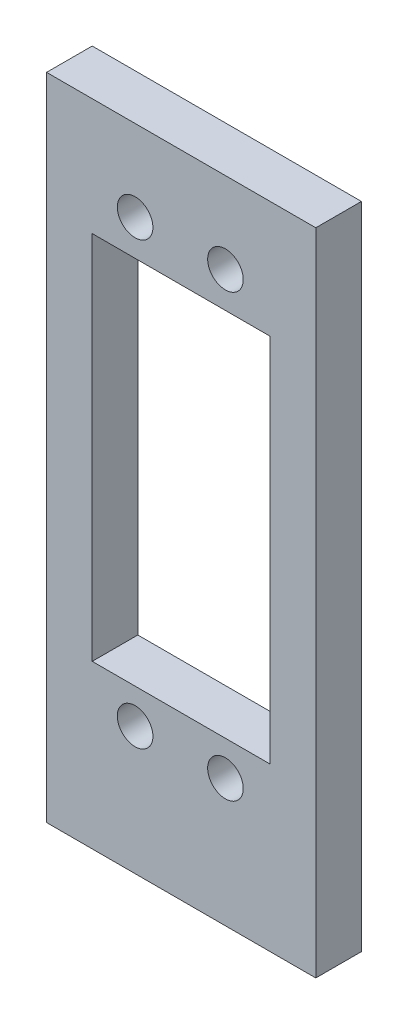
ISO-10303-21;
HEADER;
FILE_DESCRIPTION(('STEP AP214'),'2;1');
FILE_NAME('part.step','',(''),(''),'','','');
FILE_SCHEMA(('AUTOMOTIVE_DESIGN { 1 0 10303 214 1 1 1 1 }'));
ENDSEC;
DATA;
#1=APPLICATION_CONTEXT('core data for automotive mechanical design processes');
#2=APPLICATION_PROTOCOL_DEFINITION('international standard','automotive_design',2000,#1);
#3=PRODUCT_CONTEXT('',#1,'mechanical');
#4=PRODUCT('Part','Part','',(#3));
#5=PRODUCT_RELATED_PRODUCT_CATEGORY('part','',(#4));
#6=PRODUCT_DEFINITION_FORMATION('','',#4);
#7=PRODUCT_DEFINITION_CONTEXT('part definition',#1,'design');
#8=PRODUCT_DEFINITION('design','',#6,#7);
#9=PRODUCT_DEFINITION_SHAPE('','',#8);
#10=(LENGTH_UNIT() NAMED_UNIT(*) SI_UNIT(.MILLI.,.METRE.));
#11=(NAMED_UNIT(*) PLANE_ANGLE_UNIT() SI_UNIT($,.RADIAN.));
#12=(NAMED_UNIT(*) SI_UNIT($,.STERADIAN.) SOLID_ANGLE_UNIT());
#13=UNCERTAINTY_MEASURE_WITH_UNIT(LENGTH_MEASURE(1.E-05),#10,'distance_accuracy_value','');
#14=(GEOMETRIC_REPRESENTATION_CONTEXT(3) GLOBAL_UNCERTAINTY_ASSIGNED_CONTEXT((#13)) GLOBAL_UNIT_ASSIGNED_CONTEXT((#10,
#11,#12)) REPRESENTATION_CONTEXT('',''));
#15=CARTESIAN_POINT('',(0.,0.,0.));
#16=DIRECTION('',(0.,0.,1.));
#17=DIRECTION('',(1.,0.,0.));
#18=AXIS2_PLACEMENT_3D('',#15,#16,#17);
#19=CARTESIAN_POINT('',(14.75,33.1,5.));
#20=DIRECTION('',(0.,0.,-1.));
#21=DIRECTION('',(-1.,0.,0.));
#22=AXIS2_PLACEMENT_3D('',#19,#20,#21);
#23=PLANE('',#22);
#24=CARTESIAN_POINT('',(4.85,-24.1,5.));
#25=DIRECTION('',(0.,0.,1.));
#26=DIRECTION('',(1.,0.,0.));
#27=AXIS2_PLACEMENT_3D('',#24,#25,#26);
#28=CIRCLE('',#27,1.95);
#29=CARTESIAN_POINT('',(6.8,-24.1,5.));
#30=VERTEX_POINT('',#29);
#31=EDGE_CURVE('E180',#30,#30,#28,.T.);
#32=ORIENTED_EDGE('',*,*,#31,.F.);
#33=EDGE_LOOP('',(#32));
#34=FACE_BOUND('',#33,.T.);
#35=CARTESIAN_POINT('',(-5.05,-24.1,5.));
#36=DIRECTION('',(0.,0.,1.));
#37=DIRECTION('',(1.,0.,0.));
#38=AXIS2_PLACEMENT_3D('',#35,#36,#37);
#39=CIRCLE('',#38,1.95);
#40=CARTESIAN_POINT('',(-3.1,-24.1,5.));
#41=VERTEX_POINT('',#40);
#42=EDGE_CURVE('E170',#41,#41,#39,.T.);
#43=ORIENTED_EDGE('',*,*,#42,.F.);
#44=EDGE_LOOP('',(#43));
#45=FACE_BOUND('',#44,.T.);
#46=CARTESIAN_POINT('',(4.85,24.2,5.));
#47=DIRECTION('',(0.,0.,1.));
#48=DIRECTION('',(1.,0.,0.));
#49=AXIS2_PLACEMENT_3D('',#46,#47,#48);
#50=CIRCLE('',#49,1.95);
#51=CARTESIAN_POINT('',(6.8,24.2,5.));
#52=VERTEX_POINT('',#51);
#53=EDGE_CURVE('E167',#52,#52,#50,.T.);
#54=ORIENTED_EDGE('',*,*,#53,.F.);
#55=EDGE_LOOP('',(#54));
#56=FACE_BOUND('',#55,.T.);
#57=CARTESIAN_POINT('',(-5.05,24.2,5.));
#58=DIRECTION('',(0.,0.,1.));
#59=DIRECTION('',(1.,0.,0.));
#60=AXIS2_PLACEMENT_3D('',#57,#58,#59);
#61=CIRCLE('',#60,1.95);
#62=CARTESIAN_POINT('',(-3.1,24.2,5.));
#63=VERTEX_POINT('',#62);
#64=EDGE_CURVE('E164',#63,#63,#61,.T.);
#65=ORIENTED_EDGE('',*,*,#64,.F.);
#66=EDGE_LOOP('',(#65));
#67=FACE_BOUND('',#66,.T.);
#68=DIRECTION('',(0.,1.,0.));
#69=VECTOR('',#68,1.);
#70=CARTESIAN_POINT('',(14.75,-38.1,5.));
#71=LINE('',#70,#69);
#72=CARTESIAN_POINT('',(14.75,-38.1,5.));
#73=VERTEX_POINT('',#72);
#74=CARTESIAN_POINT('',(14.75,33.1,5.));
#75=VERTEX_POINT('',#74);
#76=EDGE_CURVE('E137',#73,#75,#71,.T.);
#77=ORIENTED_EDGE('',*,*,#76,.T.);
#78=DIRECTION('',(-1.,0.,0.));
#79=VECTOR('',#78,1.);
#80=CARTESIAN_POINT('',(-14.75,33.1,5.));
#81=LINE('',#80,#79);
#82=CARTESIAN_POINT('',(-14.75,33.1,5.));
#83=VERTEX_POINT('',#82);
#84=EDGE_CURVE('E139',#75,#83,#81,.T.);
#85=ORIENTED_EDGE('',*,*,#84,.T.);
#86=DIRECTION('',(0.,-1.,0.));
#87=VECTOR('',#86,1.);
#88=CARTESIAN_POINT('',(-14.75,33.1,5.));
#89=LINE('',#88,#87);
#90=CARTESIAN_POINT('',(-14.75,-38.1,5.));
#91=VERTEX_POINT('',#90);
#92=EDGE_CURVE('E142',#83,#91,#89,.T.);
#93=ORIENTED_EDGE('',*,*,#92,.T.);
#94=DIRECTION('',(1.,0.,0.));
#95=VECTOR('',#94,1.);
#96=CARTESIAN_POINT('',(-14.75,-38.1,5.));
#97=LINE('',#96,#95);
#98=EDGE_CURVE('E144',#91,#73,#97,.T.);
#99=ORIENTED_EDGE('',*,*,#98,.T.);
#100=EDGE_LOOP('',(#77,#85,#93,#99));
#101=FACE_BOUND('',#100,.T.);
#102=DIRECTION('',(-1.,0.,0.));
#103=VECTOR('',#102,1.);
#104=CARTESIAN_POINT('',(9.75,20.3,5.));
#105=LINE('',#104,#103);
#106=CARTESIAN_POINT('',(9.75,20.3,5.));
#107=VERTEX_POINT('',#106);
#108=CARTESIAN_POINT('',(-9.75,20.3,5.));
#109=VERTEX_POINT('',#108);
#110=EDGE_CURVE('E99',#107,#109,#105,.T.);
#111=ORIENTED_EDGE('',*,*,#110,.F.);
#112=DIRECTION('',(0.,1.,0.));
#113=VECTOR('',#112,1.);
#114=CARTESIAN_POINT('',(9.75,-20.3,5.));
#115=LINE('',#114,#113);
#116=CARTESIAN_POINT('',(9.75,-20.3,5.));
#117=VERTEX_POINT('',#116);
#118=EDGE_CURVE('E121',#117,#107,#115,.T.);
#119=ORIENTED_EDGE('',*,*,#118,.F.);
#120=DIRECTION('',(1.,0.,0.));
#121=VECTOR('',#120,1.);
#122=CARTESIAN_POINT('',(9.75,-20.3,5.));
#123=LINE('',#122,#121);
#124=CARTESIAN_POINT('',(-9.75,-20.3,5.));
#125=VERTEX_POINT('',#124);
#126=EDGE_CURVE('E119',#125,#117,#123,.T.);
#127=ORIENTED_EDGE('',*,*,#126,.F.);
#128=DIRECTION('',(0.,-1.,0.));
#129=VECTOR('',#128,1.);
#130=CARTESIAN_POINT('',(-9.75,-20.3,5.));
#131=LINE('',#130,#129);
#132=EDGE_CURVE('E107',#109,#125,#131,.T.);
#133=ORIENTED_EDGE('',*,*,#132,.F.);
#134=EDGE_LOOP('',(#111,#119,#127,#133));
#135=FACE_BOUND('',#134,.T.);
#136=ADVANCED_FACE('F32',(#34,#45,#56,#67,#101,#135),#23,.F.);
#137=CARTESIAN_POINT('',(14.75,33.1,0.));
#138=DIRECTION('',(0.,0.,-1.));
#139=DIRECTION('',(-1.,0.,0.));
#140=AXIS2_PLACEMENT_3D('',#137,#138,#139);
#141=PLANE('',#140);
#142=CARTESIAN_POINT('',(4.85,-24.1,0.));
#143=DIRECTION('',(0.,0.,-1.));
#144=DIRECTION('',(-1.,0.,0.));
#145=AXIS2_PLACEMENT_3D('',#142,#143,#144);
#146=CIRCLE('',#145,1.95);
#147=CARTESIAN_POINT('',(2.9,-24.1,0.));
#148=VERTEX_POINT('',#147);
#149=EDGE_CURVE('E36',#148,#148,#146,.T.);
#150=ORIENTED_EDGE('',*,*,#149,.F.);
#151=EDGE_LOOP('',(#150));
#152=FACE_BOUND('',#151,.T.);
#153=CARTESIAN_POINT('',(-5.05,-24.1,0.));
#154=DIRECTION('',(0.,0.,-1.));
#155=DIRECTION('',(-1.,0.,0.));
#156=AXIS2_PLACEMENT_3D('',#153,#154,#155);
#157=CIRCLE('',#156,1.95);
#158=CARTESIAN_POINT('',(-7.,-24.1,0.));
#159=VERTEX_POINT('',#158);
#160=EDGE_CURVE('E168',#159,#159,#157,.T.);
#161=ORIENTED_EDGE('',*,*,#160,.F.);
#162=EDGE_LOOP('',(#161));
#163=FACE_BOUND('',#162,.T.);
#164=CARTESIAN_POINT('',(4.85,24.2,0.));
#165=DIRECTION('',(0.,0.,-1.));
#166=DIRECTION('',(-1.,0.,0.));
#167=AXIS2_PLACEMENT_3D('',#164,#165,#166);
#168=CIRCLE('',#167,1.95);
#169=CARTESIAN_POINT('',(2.9,24.2,0.));
#170=VERTEX_POINT('',#169);
#171=EDGE_CURVE('E165',#170,#170,#168,.T.);
#172=ORIENTED_EDGE('',*,*,#171,.F.);
#173=EDGE_LOOP('',(#172));
#174=FACE_BOUND('',#173,.T.);
#175=CARTESIAN_POINT('',(-5.05,24.2,0.));
#176=DIRECTION('',(0.,0.,-1.));
#177=DIRECTION('',(-1.,0.,0.));
#178=AXIS2_PLACEMENT_3D('',#175,#176,#177);
#179=CIRCLE('',#178,1.95);
#180=CARTESIAN_POINT('',(-7.,24.2,0.));
#181=VERTEX_POINT('',#180);
#182=EDGE_CURVE('E127',#181,#181,#179,.T.);
#183=ORIENTED_EDGE('',*,*,#182,.F.);
#184=EDGE_LOOP('',(#183));
#185=FACE_BOUND('',#184,.T.);
#186=DIRECTION('',(0.,1.,0.));
#187=VECTOR('',#186,1.);
#188=CARTESIAN_POINT('',(14.75,33.1,0.));
#189=LINE('',#188,#187);
#190=CARTESIAN_POINT('',(14.75,-38.1,0.));
#191=VERTEX_POINT('',#190);
#192=CARTESIAN_POINT('',(14.75,33.1,0.));
#193=VERTEX_POINT('',#192);
#194=EDGE_CURVE('E115',#191,#193,#189,.T.);
#195=ORIENTED_EDGE('',*,*,#194,.F.);
#196=DIRECTION('',(1.,0.,0.));
#197=VECTOR('',#196,1.);
#198=CARTESIAN_POINT('',(-14.75,-38.1,0.));
#199=LINE('',#198,#197);
#200=CARTESIAN_POINT('',(-14.75,-38.1,0.));
#201=VERTEX_POINT('',#200);
#202=EDGE_CURVE('E140',#201,#191,#199,.T.);
#203=ORIENTED_EDGE('',*,*,#202,.F.);
#204=DIRECTION('',(0.,-1.,0.));
#205=VECTOR('',#204,1.);
#206=CARTESIAN_POINT('',(-14.75,0.,0.));
#207=LINE('',#206,#205);
#208=CARTESIAN_POINT('',(-14.75,33.1,0.));
#209=VERTEX_POINT('',#208);
#210=EDGE_CURVE('E151',#209,#201,#207,.T.);
#211=ORIENTED_EDGE('',*,*,#210,.F.);
#212=DIRECTION('',(-1.,0.,0.));
#213=VECTOR('',#212,1.);
#214=CARTESIAN_POINT('',(-14.75,33.1,0.));
#215=LINE('',#214,#213);
#216=EDGE_CURVE('E148',#193,#209,#215,.T.);
#217=ORIENTED_EDGE('',*,*,#216,.F.);
#218=EDGE_LOOP('',(#195,#203,#211,#217));
#219=FACE_BOUND('',#218,.T.);
#220=DIRECTION('',(0.,1.,0.));
#221=VECTOR('',#220,1.);
#222=CARTESIAN_POINT('',(9.75,-20.3,0.));
#223=LINE('',#222,#221);
#224=CARTESIAN_POINT('',(9.75,-20.3,0.));
#225=VERTEX_POINT('',#224);
#226=CARTESIAN_POINT('',(9.75,20.3,0.));
#227=VERTEX_POINT('',#226);
#228=EDGE_CURVE('E108',#225,#227,#223,.T.);
#229=ORIENTED_EDGE('',*,*,#228,.T.);
#230=DIRECTION('',(-1.,0.,0.));
#231=VECTOR('',#230,1.);
#232=CARTESIAN_POINT('',(9.75,20.3,0.));
#233=LINE('',#232,#231);
#234=CARTESIAN_POINT('',(-9.75,20.3,0.));
#235=VERTEX_POINT('',#234);
#236=EDGE_CURVE('E57',#227,#235,#233,.T.);
#237=ORIENTED_EDGE('',*,*,#236,.T.);
#238=DIRECTION('',(0.,-1.,0.));
#239=VECTOR('',#238,1.);
#240=CARTESIAN_POINT('',(-9.75,-20.3,0.));
#241=LINE('',#240,#239);
#242=CARTESIAN_POINT('',(-9.75,-20.3,0.));
#243=VERTEX_POINT('',#242);
#244=EDGE_CURVE('E114',#235,#243,#241,.T.);
#245=ORIENTED_EDGE('',*,*,#244,.T.);
#246=DIRECTION('',(1.,0.,0.));
#247=VECTOR('',#246,1.);
#248=CARTESIAN_POINT('',(9.75,-20.3,0.));
#249=LINE('',#248,#247);
#250=EDGE_CURVE('E129',#243,#225,#249,.T.);
#251=ORIENTED_EDGE('',*,*,#250,.T.);
#252=EDGE_LOOP('',(#229,#237,#245,#251));
#253=FACE_BOUND('',#252,.T.);
#254=ADVANCED_FACE('F189',(#152,#163,#174,#185,#219,#253),#141,.T.);
#255=CARTESIAN_POINT('',(14.75,33.1,5.));
#256=DIRECTION('',(-1.,0.,0.));
#257=DIRECTION('',(0.,0.,1.));
#258=AXIS2_PLACEMENT_3D('',#255,#256,#257);
#259=PLANE('',#258);
#260=ORIENTED_EDGE('',*,*,#194,.T.);
#261=DIRECTION('',(0.,0.,-1.));
#262=VECTOR('',#261,1.);
#263=CARTESIAN_POINT('',(14.75,33.1,5.));
#264=LINE('',#263,#262);
#265=EDGE_CURVE('E11',#75,#193,#264,.T.);
#266=ORIENTED_EDGE('',*,*,#265,.F.);
#267=ORIENTED_EDGE('',*,*,#76,.F.);
#268=DIRECTION('',(0.,0.,-1.));
#269=VECTOR('',#268,1.);
#270=CARTESIAN_POINT('',(14.75,-38.1,5.));
#271=LINE('',#270,#269);
#272=EDGE_CURVE('E146',#73,#191,#271,.T.);
#273=ORIENTED_EDGE('',*,*,#272,.T.);
#274=EDGE_LOOP('',(#260,#266,#267,#273));
#275=FACE_BOUND('',#274,.T.);
#276=ADVANCED_FACE('F34',(#275),#259,.F.);
#277=CARTESIAN_POINT('',(-14.75,33.1,5.));
#278=DIRECTION('',(0.,-1.,0.));
#279=DIRECTION('',(0.,0.,-1.));
#280=AXIS2_PLACEMENT_3D('',#277,#278,#279);
#281=PLANE('',#280);
#282=ORIENTED_EDGE('',*,*,#216,.T.);
#283=DIRECTION('',(0.,0.,-1.));
#284=VECTOR('',#283,1.);
#285=CARTESIAN_POINT('',(-14.75,33.1,5.));
#286=LINE('',#285,#284);
#287=EDGE_CURVE('E41',#83,#209,#286,.T.);
#288=ORIENTED_EDGE('',*,*,#287,.F.);
#289=ORIENTED_EDGE('',*,*,#84,.F.);
#290=ORIENTED_EDGE('',*,*,#265,.T.);
#291=EDGE_LOOP('',(#282,#288,#289,#290));
#292=FACE_BOUND('',#291,.T.);
#293=ADVANCED_FACE('F201',(#292),#281,.F.);
#294=CARTESIAN_POINT('',(-14.75,0.,5.));
#295=DIRECTION('',(1.,0.,0.));
#296=DIRECTION('',(0.,1.,0.));
#297=AXIS2_PLACEMENT_3D('',#294,#295,#296);
#298=PLANE('',#297);
#299=ORIENTED_EDGE('',*,*,#210,.T.);
#300=DIRECTION('',(0.,0.,-1.));
#301=VECTOR('',#300,1.);
#302=CARTESIAN_POINT('',(-14.75,-38.1,5.));
#303=LINE('',#302,#301);
#304=EDGE_CURVE('E157',#91,#201,#303,.T.);
#305=ORIENTED_EDGE('',*,*,#304,.F.);
#306=ORIENTED_EDGE('',*,*,#92,.F.);
#307=ORIENTED_EDGE('',*,*,#287,.T.);
#308=EDGE_LOOP('',(#299,#305,#306,#307));
#309=FACE_BOUND('',#308,.T.);
#310=ADVANCED_FACE('F205',(#309),#298,.F.);
#311=CARTESIAN_POINT('',(-14.75,-38.1,5.));
#312=DIRECTION('',(0.,1.,0.));
#313=DIRECTION('',(0.,0.,1.));
#314=AXIS2_PLACEMENT_3D('',#311,#312,#313);
#315=PLANE('',#314);
#316=ORIENTED_EDGE('',*,*,#202,.T.);
#317=ORIENTED_EDGE('',*,*,#272,.F.);
#318=ORIENTED_EDGE('',*,*,#98,.F.);
#319=ORIENTED_EDGE('',*,*,#304,.T.);
#320=EDGE_LOOP('',(#316,#317,#318,#319));
#321=FACE_BOUND('',#320,.T.);
#322=ADVANCED_FACE('F208',(#321),#315,.F.);
#323=CARTESIAN_POINT('',(9.75,20.3,5.));
#324=DIRECTION('',(0.,-1.,0.));
#325=DIRECTION('',(0.,0.,-1.));
#326=AXIS2_PLACEMENT_3D('',#323,#324,#325);
#327=PLANE('',#326);
#328=ORIENTED_EDGE('',*,*,#236,.F.);
#329=DIRECTION('',(0.,0.,-1.));
#330=VECTOR('',#329,1.);
#331=CARTESIAN_POINT('',(9.75,20.3,5.));
#332=LINE('',#331,#330);
#333=EDGE_CURVE('E103',#107,#227,#332,.T.);
#334=ORIENTED_EDGE('',*,*,#333,.F.);
#335=ORIENTED_EDGE('',*,*,#110,.T.);
#336=DIRECTION('',(0.,0.,-1.));
#337=VECTOR('',#336,1.);
#338=CARTESIAN_POINT('',(-9.75,20.3,5.));
#339=LINE('',#338,#337);
#340=EDGE_CURVE('E102',#109,#235,#339,.T.);
#341=ORIENTED_EDGE('',*,*,#340,.T.);
#342=EDGE_LOOP('',(#328,#334,#335,#341));
#343=FACE_BOUND('',#342,.T.);
#344=ADVANCED_FACE('F101',(#343),#327,.T.);
#345=CARTESIAN_POINT('',(-9.75,-20.3,5.));
#346=DIRECTION('',(1.,0.,0.));
#347=DIRECTION('',(0.,0.,-1.));
#348=AXIS2_PLACEMENT_3D('',#345,#346,#347);
#349=PLANE('',#348);
#350=ORIENTED_EDGE('',*,*,#244,.F.);
#351=ORIENTED_EDGE('',*,*,#340,.F.);
#352=ORIENTED_EDGE('',*,*,#132,.T.);
#353=DIRECTION('',(0.,0.,-1.));
#354=VECTOR('',#353,1.);
#355=CARTESIAN_POINT('',(-9.75,-20.3,5.));
#356=LINE('',#355,#354);
#357=EDGE_CURVE('E116',#125,#243,#356,.T.);
#358=ORIENTED_EDGE('',*,*,#357,.T.);
#359=EDGE_LOOP('',(#350,#351,#352,#358));
#360=FACE_BOUND('',#359,.T.);
#361=ADVANCED_FACE('F111',(#360),#349,.T.);
#362=CARTESIAN_POINT('',(9.75,-20.3,5.));
#363=DIRECTION('',(0.,1.,0.));
#364=DIRECTION('',(0.,0.,1.));
#365=AXIS2_PLACEMENT_3D('',#362,#363,#364);
#366=PLANE('',#365);
#367=ORIENTED_EDGE('',*,*,#250,.F.);
#368=ORIENTED_EDGE('',*,*,#357,.F.);
#369=ORIENTED_EDGE('',*,*,#126,.T.);
#370=DIRECTION('',(0.,0.,-1.));
#371=VECTOR('',#370,1.);
#372=CARTESIAN_POINT('',(9.75,-20.3,5.));
#373=LINE('',#372,#371);
#374=EDGE_CURVE('E49',#117,#225,#373,.T.);
#375=ORIENTED_EDGE('',*,*,#374,.T.);
#376=EDGE_LOOP('',(#367,#368,#369,#375));
#377=FACE_BOUND('',#376,.T.);
#378=ADVANCED_FACE('F217',(#377),#366,.T.);
#379=CARTESIAN_POINT('',(9.75,-20.3,5.));
#380=DIRECTION('',(-1.,0.,0.));
#381=DIRECTION('',(0.,0.,1.));
#382=AXIS2_PLACEMENT_3D('',#379,#380,#381);
#383=PLANE('',#382);
#384=ORIENTED_EDGE('',*,*,#228,.F.);
#385=ORIENTED_EDGE('',*,*,#374,.F.);
#386=ORIENTED_EDGE('',*,*,#118,.T.);
#387=ORIENTED_EDGE('',*,*,#333,.T.);
#388=EDGE_LOOP('',(#384,#385,#386,#387));
#389=FACE_BOUND('',#388,.T.);
#390=ADVANCED_FACE('F215',(#389),#383,.T.);
#391=CARTESIAN_POINT('',(-5.05,24.2,-5.));
#392=DIRECTION('',(0.,0.,1.));
#393=DIRECTION('',(1.,0.,0.));
#394=AXIS2_PLACEMENT_3D('',#391,#392,#393);
#395=CYLINDRICAL_SURFACE('',#394,1.95);
#396=ORIENTED_EDGE('',*,*,#182,.T.);
#397=EDGE_LOOP('',(#396));
#398=FACE_BOUND('',#397,.T.);
#399=ORIENTED_EDGE('',*,*,#64,.T.);
#400=EDGE_LOOP('',(#399));
#401=FACE_BOUND('',#400,.T.);
#402=ADVANCED_FACE('F185',(#398,#401),#395,.F.);
#403=CARTESIAN_POINT('',(4.85,24.2,-5.));
#404=DIRECTION('',(0.,0.,1.));
#405=DIRECTION('',(1.,0.,0.));
#406=AXIS2_PLACEMENT_3D('',#403,#404,#405);
#407=CYLINDRICAL_SURFACE('',#406,1.95);
#408=ORIENTED_EDGE('',*,*,#171,.T.);
#409=EDGE_LOOP('',(#408));
#410=FACE_BOUND('',#409,.T.);
#411=ORIENTED_EDGE('',*,*,#53,.T.);
#412=EDGE_LOOP('',(#411));
#413=FACE_BOUND('',#412,.T.);
#414=ADVANCED_FACE('F223',(#410,#413),#407,.F.);
#415=CARTESIAN_POINT('',(-5.05,-24.1,-5.));
#416=DIRECTION('',(0.,0.,1.));
#417=DIRECTION('',(1.,0.,0.));
#418=AXIS2_PLACEMENT_3D('',#415,#416,#417);
#419=CYLINDRICAL_SURFACE('',#418,1.95);
#420=ORIENTED_EDGE('',*,*,#160,.T.);
#421=EDGE_LOOP('',(#420));
#422=FACE_BOUND('',#421,.T.);
#423=ORIENTED_EDGE('',*,*,#42,.T.);
#424=EDGE_LOOP('',(#423));
#425=FACE_BOUND('',#424,.T.);
#426=ADVANCED_FACE('F318',(#422,#425),#419,.F.);
#427=CARTESIAN_POINT('',(4.85,-24.1,-5.));
#428=DIRECTION('',(0.,0.,1.));
#429=DIRECTION('',(1.,0.,0.));
#430=AXIS2_PLACEMENT_3D('',#427,#428,#429);
#431=CYLINDRICAL_SURFACE('',#430,1.95);
#432=ORIENTED_EDGE('',*,*,#149,.T.);
#433=EDGE_LOOP('',(#432));
#434=FACE_BOUND('',#433,.T.);
#435=ORIENTED_EDGE('',*,*,#31,.T.);
#436=EDGE_LOOP('',(#435));
#437=FACE_BOUND('',#436,.T.);
#438=ADVANCED_FACE('F326',(#434,#437),#431,.F.);
#439=CLOSED_SHELL('',(#136,#254,#276,#293,#310,#322,#344,#361,#378,#390,#402,#414,#426,#438));
#440=MANIFOLD_SOLID_BREP('B2',#439);
#441=ADVANCED_BREP_SHAPE_REPRESENTATION('',(#18,#440),#14);
#442=SHAPE_DEFINITION_REPRESENTATION(#9,#441);
ENDSEC;
END-ISO-10303-21;
